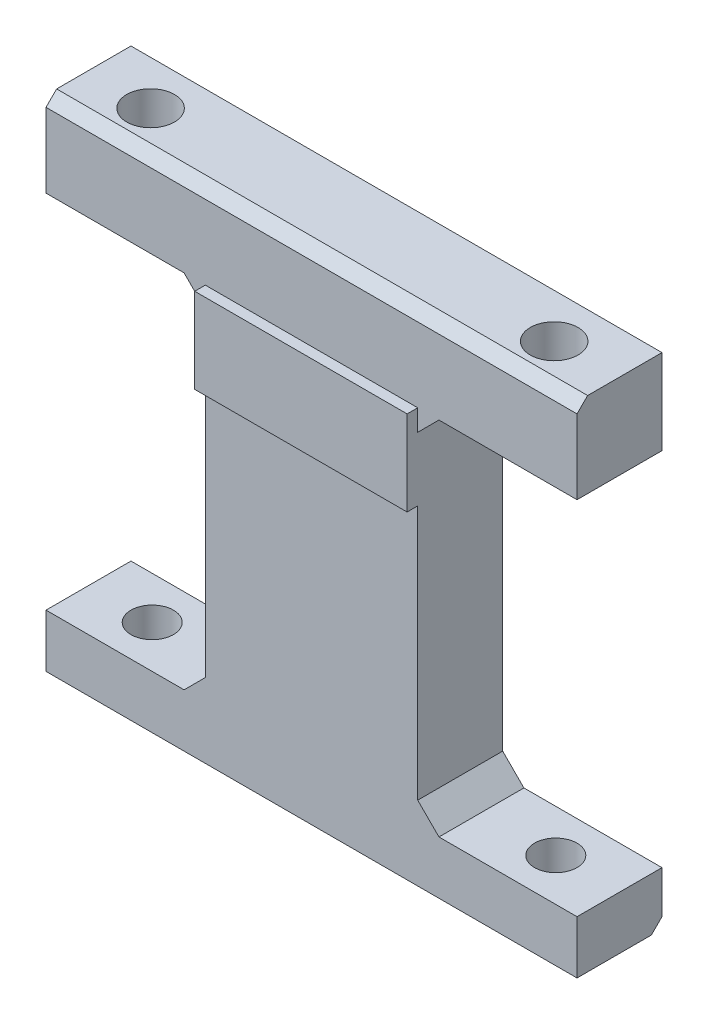
ISO-10303-21;
HEADER;
FILE_DESCRIPTION(('STEP AP214'),'2;1');
FILE_NAME('part.step','',(''),(''),'','','');
FILE_SCHEMA(('AUTOMOTIVE_DESIGN { 1 0 10303 214 1 1 1 1 }'));
ENDSEC;
DATA;
#1=APPLICATION_CONTEXT('core data for automotive mechanical design processes');
#2=APPLICATION_PROTOCOL_DEFINITION('international standard','automotive_design',2000,#1);
#3=PRODUCT_CONTEXT('',#1,'mechanical');
#4=PRODUCT('Part','Part','',(#3));
#5=PRODUCT_RELATED_PRODUCT_CATEGORY('part','',(#4));
#6=PRODUCT_DEFINITION_FORMATION('','',#4);
#7=PRODUCT_DEFINITION_CONTEXT('part definition',#1,'design');
#8=PRODUCT_DEFINITION('design','',#6,#7);
#9=PRODUCT_DEFINITION_SHAPE('','',#8);
#10=(LENGTH_UNIT() NAMED_UNIT(*) SI_UNIT(.MILLI.,.METRE.));
#11=(NAMED_UNIT(*) PLANE_ANGLE_UNIT() SI_UNIT($,.RADIAN.));
#12=(NAMED_UNIT(*) SI_UNIT($,.STERADIAN.) SOLID_ANGLE_UNIT());
#13=UNCERTAINTY_MEASURE_WITH_UNIT(LENGTH_MEASURE(1.E-05),#10,'distance_accuracy_value','');
#14=(GEOMETRIC_REPRESENTATION_CONTEXT(3) GLOBAL_UNCERTAINTY_ASSIGNED_CONTEXT((#13)) GLOBAL_UNIT_ASSIGNED_CONTEXT((#10,
#11,#12)) REPRESENTATION_CONTEXT('',''));
#15=CARTESIAN_POINT('',(0.,0.,0.));
#16=DIRECTION('',(0.,0.,1.));
#17=DIRECTION('',(1.,0.,0.));
#18=AXIS2_PLACEMENT_3D('',#15,#16,#17);
#19=CARTESIAN_POINT('',(0.,0.,0.));
#20=DIRECTION('',(0.,0.,1.));
#21=DIRECTION('',(1.,0.,0.));
#22=AXIS2_PLACEMENT_3D('',#19,#20,#21);
#23=PLANE('',#22);
#24=DIRECTION('',(0.,1.,0.));
#25=VECTOR('',#24,1.);
#26=CARTESIAN_POINT('',(25.,39.,0.));
#27=LINE('',#26,#25);
#28=CARTESIAN_POINT('',(25.,39.,0.));
#29=VERTEX_POINT('',#28);
#30=CARTESIAN_POINT('',(25.,46.,0.));
#31=VERTEX_POINT('',#30);
#32=EDGE_CURVE('E285',#29,#31,#27,.T.);
#33=ORIENTED_EDGE('',*,*,#32,.T.);
#34=DIRECTION('',(-1.,0.,0.));
#35=VECTOR('',#34,1.);
#36=CARTESIAN_POINT('',(0.,46.,0.));
#37=LINE('',#36,#35);
#38=CARTESIAN_POINT('',(-25.,46.,0.));
#39=VERTEX_POINT('',#38);
#40=EDGE_CURVE('E447',#31,#39,#37,.T.);
#41=ORIENTED_EDGE('',*,*,#40,.T.);
#42=DIRECTION('',(0.,-1.,0.));
#43=VECTOR('',#42,1.);
#44=CARTESIAN_POINT('',(-25.,47.,0.));
#45=LINE('',#44,#43);
#46=CARTESIAN_POINT('',(-25.,39.,0.));
#47=VERTEX_POINT('',#46);
#48=EDGE_CURVE('E299',#39,#47,#45,.T.);
#49=ORIENTED_EDGE('',*,*,#48,.T.);
#50=DIRECTION('',(1.,0.,0.));
#51=VECTOR('',#50,1.);
#52=CARTESIAN_POINT('',(-25.,39.,0.));
#53=LINE('',#52,#51);
#54=CARTESIAN_POINT('',(-12.,39.,0.));
#55=VERTEX_POINT('',#54);
#56=EDGE_CURVE('E304',#47,#55,#53,.T.);
#57=ORIENTED_EDGE('',*,*,#56,.T.);
#58=DIRECTION('',(-0.707106781186552,0.707106781186543,0.));
#59=VECTOR('',#58,1.);
#60=CARTESIAN_POINT('',(-12.,39.,0.));
#61=LINE('',#60,#59);
#62=CARTESIAN_POINT('',(-10.,37.,0.));
#63=VERTEX_POINT('',#62);
#64=EDGE_CURVE('E429',#55,#63,#61,.F.);
#65=ORIENTED_EDGE('',*,*,#64,.T.);
#66=DIRECTION('',(0.,-1.,0.));
#67=VECTOR('',#66,1.);
#68=CARTESIAN_POINT('',(-9.99999999999999,0.,0.));
#69=LINE('',#68,#67);
#70=CARTESIAN_POINT('',(-10.,39.,0.));
#71=VERTEX_POINT('',#70);
#72=EDGE_CURVE('E412',#71,#63,#69,.T.);
#73=ORIENTED_EDGE('',*,*,#72,.F.);
#74=DIRECTION('',(-1.,0.,0.));
#75=VECTOR('',#74,1.);
#76=CARTESIAN_POINT('',(-10.,39.,0.));
#77=LINE('',#76,#75);
#78=CARTESIAN_POINT('',(10.,39.,0.));
#79=VERTEX_POINT('',#78);
#80=EDGE_CURVE('E249',#79,#71,#77,.T.);
#81=ORIENTED_EDGE('',*,*,#80,.F.);
#82=DIRECTION('',(0.,1.,0.));
#83=VECTOR('',#82,1.);
#84=CARTESIAN_POINT('',(10.,0.,0.));
#85=LINE('',#84,#83);
#86=CARTESIAN_POINT('',(10.,37.,0.));
#87=VERTEX_POINT('',#86);
#88=EDGE_CURVE('E392',#87,#79,#85,.T.);
#89=ORIENTED_EDGE('',*,*,#88,.F.);
#90=DIRECTION('',(-0.707106781186542,-0.707106781186553,0.));
#91=VECTOR('',#90,1.);
#92=CARTESIAN_POINT('',(10.,37.,0.));
#93=LINE('',#92,#91);
#94=CARTESIAN_POINT('',(12.,39.,0.));
#95=VERTEX_POINT('',#94);
#96=EDGE_CURVE('E423',#87,#95,#93,.F.);
#97=ORIENTED_EDGE('',*,*,#96,.T.);
#98=EDGE_CURVE('E302',#95,#29,#53,.T.);
#99=ORIENTED_EDGE('',*,*,#98,.T.);
#100=EDGE_LOOP('',(#33,#41,#49,#57,#65,#73,#81,#89,#97,#99));
#101=FACE_BOUND('',#100,.T.);
#102=ADVANCED_FACE('F77',(#101),#23,.T.);
#103=CARTESIAN_POINT('',(25.,47.,-8.));
#104=DIRECTION('',(0.,1.,0.));
#105=DIRECTION('',(-1.,0.,0.));
#106=AXIS2_PLACEMENT_3D('',#103,#104,#105);
#107=PLANE('',#106);
#108=CARTESIAN_POINT('',(-19.,47.,-3.8474065138723));
#109=DIRECTION('',(0.,1.,0.));
#110=DIRECTION('',(-1.,0.,0.));
#111=AXIS2_PLACEMENT_3D('',#108,#109,#110);
#112=CIRCLE('',#111,2.25);
#113=CARTESIAN_POINT('',(-21.25,47.,-3.8474065138723));
#114=VERTEX_POINT('',#113);
#115=EDGE_CURVE('E389',#114,#114,#112,.T.);
#116=ORIENTED_EDGE('',*,*,#115,.F.);
#117=EDGE_LOOP('',(#116));
#118=FACE_BOUND('',#117,.T.);
#119=CARTESIAN_POINT('',(19.,47.,-3.8474065138723));
#120=DIRECTION('',(0.,1.,0.));
#121=DIRECTION('',(-1.,0.,0.));
#122=AXIS2_PLACEMENT_3D('',#119,#120,#121);
#123=CIRCLE('',#122,2.25);
#124=CARTESIAN_POINT('',(16.75,47.,-3.8474065138723));
#125=VERTEX_POINT('',#124);
#126=EDGE_CURVE('E384',#125,#125,#123,.T.);
#127=ORIENTED_EDGE('',*,*,#126,.F.);
#128=EDGE_LOOP('',(#127));
#129=FACE_BOUND('',#128,.T.);
#130=DIRECTION('',(0.,0.,1.));
#131=VECTOR('',#130,1.);
#132=CARTESIAN_POINT('',(-25.,47.,-8.));
#133=LINE('',#132,#131);
#134=CARTESIAN_POINT('',(-25.,47.,-8.));
#135=VERTEX_POINT('',#134);
#136=CARTESIAN_POINT('',(-25.,47.,-1.00000000000001));
#137=VERTEX_POINT('',#136);
#138=EDGE_CURVE('E311',#135,#137,#133,.T.);
#139=ORIENTED_EDGE('',*,*,#138,.T.);
#140=DIRECTION('',(1.,0.,0.));
#141=VECTOR('',#140,1.);
#142=CARTESIAN_POINT('',(25.,47.,-1.00000000000001));
#143=LINE('',#142,#141);
#144=CARTESIAN_POINT('',(25.,47.,-1.00000000000001));
#145=VERTEX_POINT('',#144);
#146=EDGE_CURVE('E454',#137,#145,#143,.T.);
#147=ORIENTED_EDGE('',*,*,#146,.T.);
#148=DIRECTION('',(0.,0.,1.));
#149=VECTOR('',#148,1.);
#150=CARTESIAN_POINT('',(25.,47.,-8.));
#151=LINE('',#150,#149);
#152=CARTESIAN_POINT('',(25.,47.,-8.));
#153=VERTEX_POINT('',#152);
#154=EDGE_CURVE('E316',#153,#145,#151,.T.);
#155=ORIENTED_EDGE('',*,*,#154,.F.);
#156=DIRECTION('',(-1.,0.,0.));
#157=VECTOR('',#156,1.);
#158=CARTESIAN_POINT('',(25.,47.,-8.));
#159=LINE('',#158,#157);
#160=EDGE_CURVE('E294',#153,#135,#159,.T.);
#161=ORIENTED_EDGE('',*,*,#160,.T.);
#162=EDGE_LOOP('',(#139,#147,#155,#161));
#163=FACE_BOUND('',#162,.T.);
#164=ADVANCED_FACE('F539',(#118,#129,#163),#107,.T.);
#165=CARTESIAN_POINT('',(25.,39.,-8.));
#166=DIRECTION('',(1.,0.,0.));
#167=DIRECTION('',(0.,0.,-1.));
#168=AXIS2_PLACEMENT_3D('',#165,#166,#167);
#169=PLANE('',#168);
#170=ORIENTED_EDGE('',*,*,#154,.T.);
#171=DIRECTION('',(0.,0.707106781186544,-0.707106781186551));
#172=VECTOR('',#171,1.);
#173=CARTESIAN_POINT('',(25.,46.5,-0.500000000000048));
#174=LINE('',#173,#172);
#175=EDGE_CURVE('E457',#145,#31,#174,.F.);
#176=ORIENTED_EDGE('',*,*,#175,.T.);
#177=ORIENTED_EDGE('',*,*,#32,.F.);
#178=DIRECTION('',(0.,0.,1.));
#179=VECTOR('',#178,1.);
#180=CARTESIAN_POINT('',(25.,39.,-8.));
#181=LINE('',#180,#179);
#182=CARTESIAN_POINT('',(25.,39.,-8.));
#183=VERTEX_POINT('',#182);
#184=EDGE_CURVE('E320',#183,#29,#181,.T.);
#185=ORIENTED_EDGE('',*,*,#184,.F.);
#186=DIRECTION('',(0.,1.,0.));
#187=VECTOR('',#186,1.);
#188=CARTESIAN_POINT('',(25.,39.,-8.));
#189=LINE('',#188,#187);
#190=EDGE_CURVE('E290',#183,#153,#189,.T.);
#191=ORIENTED_EDGE('',*,*,#190,.T.);
#192=EDGE_LOOP('',(#170,#176,#177,#185,#191));
#193=FACE_BOUND('',#192,.T.);
#194=ADVANCED_FACE('F544',(#193),#169,.T.);
#195=CARTESIAN_POINT('',(-25.,47.,-8.));
#196=DIRECTION('',(-1.,0.,0.));
#197=DIRECTION('',(0.,-1.,0.));
#198=AXIS2_PLACEMENT_3D('',#195,#196,#197);
#199=PLANE('',#198);
#200=ORIENTED_EDGE('',*,*,#48,.F.);
#201=DIRECTION('',(0.,-0.707106781186544,0.707106781186551));
#202=VECTOR('',#201,1.);
#203=CARTESIAN_POINT('',(-25.,50.5,-4.50000000000004));
#204=LINE('',#203,#202);
#205=EDGE_CURVE('E451',#39,#137,#204,.F.);
#206=ORIENTED_EDGE('',*,*,#205,.T.);
#207=ORIENTED_EDGE('',*,*,#138,.F.);
#208=DIRECTION('',(0.,-1.,0.));
#209=VECTOR('',#208,1.);
#210=CARTESIAN_POINT('',(-25.,47.,-8.));
#211=LINE('',#210,#209);
#212=CARTESIAN_POINT('',(-25.,39.,-8.));
#213=VERTEX_POINT('',#212);
#214=EDGE_CURVE('E280',#135,#213,#211,.T.);
#215=ORIENTED_EDGE('',*,*,#214,.T.);
#216=DIRECTION('',(0.,0.,1.));
#217=VECTOR('',#216,1.);
#218=CARTESIAN_POINT('',(-25.,39.,-8.));
#219=LINE('',#218,#217);
#220=EDGE_CURVE('E298',#213,#47,#219,.T.);
#221=ORIENTED_EDGE('',*,*,#220,.T.);
#222=EDGE_LOOP('',(#200,#206,#207,#215,#221));
#223=FACE_BOUND('',#222,.T.);
#224=ADVANCED_FACE('F535',(#223),#199,.T.);
#225=DIRECTION('',(1.,0.,0.));
#226=VECTOR('',#225,1.);
#227=CARTESIAN_POINT('',(-10.,31.,0.));
#228=LINE('',#227,#226);
#229=CARTESIAN_POINT('',(-10.,31.,0.));
#230=VERTEX_POINT('',#229);
#231=CARTESIAN_POINT('',(10.,31.,0.));
#232=VERTEX_POINT('',#231);
#233=EDGE_CURVE('E383',#230,#232,#228,.T.);
#234=ORIENTED_EDGE('',*,*,#233,.F.);
#235=DIRECTION('',(0.,-1.,0.));
#236=VECTOR('',#235,1.);
#237=CARTESIAN_POINT('',(-10.,39.,0.));
#238=LINE('',#237,#236);
#239=CARTESIAN_POINT('',(-9.99999999999999,7.00000000000002,0.));
#240=VERTEX_POINT('',#239);
#241=EDGE_CURVE('E255',#230,#240,#238,.T.);
#242=ORIENTED_EDGE('',*,*,#241,.T.);
#243=DIRECTION('',(0.707106781186544,0.707106781186552,0.));
#244=VECTOR('',#243,1.);
#245=CARTESIAN_POINT('',(-9.99999999999999,7.00000000000002,0.));
#246=LINE('',#245,#244);
#247=CARTESIAN_POINT('',(-12.,5.,0.));
#248=VERTEX_POINT('',#247);
#249=EDGE_CURVE('E441',#240,#248,#246,.F.);
#250=ORIENTED_EDGE('',*,*,#249,.T.);
#251=DIRECTION('',(-1.,0.,0.));
#252=VECTOR('',#251,1.);
#253=CARTESIAN_POINT('',(25.,5.,0.));
#254=LINE('',#253,#252);
#255=CARTESIAN_POINT('',(-25.,4.99999999999999,0.));
#256=VERTEX_POINT('',#255);
#257=EDGE_CURVE('E364',#248,#256,#254,.T.);
#258=ORIENTED_EDGE('',*,*,#257,.T.);
#259=DIRECTION('',(0.,-1.,0.));
#260=VECTOR('',#259,1.);
#261=CARTESIAN_POINT('',(-25.,4.99999999999999,0.));
#262=LINE('',#261,#260);
#263=CARTESIAN_POINT('',(-25.,0.,0.));
#264=VERTEX_POINT('',#263);
#265=EDGE_CURVE('E279',#256,#264,#262,.T.);
#266=ORIENTED_EDGE('',*,*,#265,.T.);
#267=DIRECTION('',(1.,0.,0.));
#268=VECTOR('',#267,1.);
#269=CARTESIAN_POINT('',(0.,0.,0.));
#270=LINE('',#269,#268);
#271=CARTESIAN_POINT('',(25.,0.,0.));
#272=VERTEX_POINT('',#271);
#273=EDGE_CURVE('E356',#264,#272,#270,.T.);
#274=ORIENTED_EDGE('',*,*,#273,.T.);
#275=DIRECTION('',(0.,1.,0.));
#276=VECTOR('',#275,1.);
#277=CARTESIAN_POINT('',(25.,0.,0.));
#278=LINE('',#277,#276);
#279=CARTESIAN_POINT('',(25.,5.,0.));
#280=VERTEX_POINT('',#279);
#281=EDGE_CURVE('E360',#272,#280,#278,.T.);
#282=ORIENTED_EDGE('',*,*,#281,.T.);
#283=CARTESIAN_POINT('',(12.,5.,0.));
#284=VERTEX_POINT('',#283);
#285=EDGE_CURVE('E344',#280,#284,#254,.T.);
#286=ORIENTED_EDGE('',*,*,#285,.T.);
#287=DIRECTION('',(0.707106781186552,-0.707106781186543,0.));
#288=VECTOR('',#287,1.);
#289=CARTESIAN_POINT('',(12.,5.,0.));
#290=LINE('',#289,#288);
#291=CARTESIAN_POINT('',(10.,7.,0.));
#292=VERTEX_POINT('',#291);
#293=EDGE_CURVE('E435',#284,#292,#290,.F.);
#294=ORIENTED_EDGE('',*,*,#293,.T.);
#295=DIRECTION('',(0.,1.,0.));
#296=VECTOR('',#295,1.);
#297=CARTESIAN_POINT('',(10.,5.,0.));
#298=LINE('',#297,#296);
#299=EDGE_CURVE('E331',#292,#232,#298,.T.);
#300=ORIENTED_EDGE('',*,*,#299,.T.);
#301=EDGE_LOOP('',(#234,#242,#250,#258,#266,#274,#282,#286,#294,#300));
#302=FACE_BOUND('',#301,.T.);
#303=ADVANCED_FACE('F472',(#302),#23,.T.);
#304=CARTESIAN_POINT('',(0.,0.,-8.));
#305=DIRECTION('',(0.,0.,1.));
#306=DIRECTION('',(1.,0.,0.));
#307=AXIS2_PLACEMENT_3D('',#304,#305,#306);
#308=PLANE('',#307);
#309=DIRECTION('',(0.,1.,0.));
#310=VECTOR('',#309,1.);
#311=CARTESIAN_POINT('',(25.,0.,-8.));
#312=LINE('',#311,#310);
#313=CARTESIAN_POINT('',(25.,1.00000000000001,-8.));
#314=VERTEX_POINT('',#313);
#315=CARTESIAN_POINT('',(25.,5.,-8.));
#316=VERTEX_POINT('',#315);
#317=EDGE_CURVE('E343',#314,#316,#312,.T.);
#318=ORIENTED_EDGE('',*,*,#317,.F.);
#319=DIRECTION('',(-1.,0.,0.));
#320=VECTOR('',#319,1.);
#321=CARTESIAN_POINT('',(-25.,1.00000000000001,-8.));
#322=LINE('',#321,#320);
#323=CARTESIAN_POINT('',(-25.,1.00000000000001,-8.));
#324=VERTEX_POINT('',#323);
#325=EDGE_CURVE('E87',#314,#324,#322,.T.);
#326=ORIENTED_EDGE('',*,*,#325,.T.);
#327=DIRECTION('',(0.,-1.,0.));
#328=VECTOR('',#327,1.);
#329=CARTESIAN_POINT('',(-25.,4.99999999999999,-8.));
#330=LINE('',#329,#328);
#331=CARTESIAN_POINT('',(-25.,4.99999999999999,-8.));
#332=VERTEX_POINT('',#331);
#333=EDGE_CURVE('E340',#332,#324,#330,.T.);
#334=ORIENTED_EDGE('',*,*,#333,.F.);
#335=DIRECTION('',(-1.,0.,0.));
#336=VECTOR('',#335,1.);
#337=CARTESIAN_POINT('',(25.,5.,-8.));
#338=LINE('',#337,#336);
#339=CARTESIAN_POINT('',(-12.,5.,-8.));
#340=VERTEX_POINT('',#339);
#341=EDGE_CURVE('E347',#340,#332,#338,.T.);
#342=ORIENTED_EDGE('',*,*,#341,.F.);
#343=DIRECTION('',(-0.707106781186544,-0.707106781186552,0.));
#344=VECTOR('',#343,1.);
#345=CARTESIAN_POINT('',(-8.50000000000006,8.49999999999997,-8.));
#346=LINE('',#345,#344);
#347=CARTESIAN_POINT('',(-9.99999999999999,7.00000000000002,-8.));
#348=VERTEX_POINT('',#347);
#349=EDGE_CURVE('E444',#340,#348,#346,.F.);
#350=ORIENTED_EDGE('',*,*,#349,.T.);
#351=DIRECTION('',(0.,-1.,0.));
#352=VECTOR('',#351,1.);
#353=CARTESIAN_POINT('',(-10.,39.,-8.));
#354=LINE('',#353,#352);
#355=CARTESIAN_POINT('',(-10.,37.,-8.));
#356=VERTEX_POINT('',#355);
#357=EDGE_CURVE('E327',#356,#348,#354,.T.);
#358=ORIENTED_EDGE('',*,*,#357,.F.);
#359=DIRECTION('',(0.707106781186552,-0.707106781186543,0.));
#360=VECTOR('',#359,1.);
#361=CARTESIAN_POINT('',(13.5000000000001,13.5000000000003,-8.));
#362=LINE('',#361,#360);
#363=CARTESIAN_POINT('',(-12.,39.,-8.));
#364=VERTEX_POINT('',#363);
#365=EDGE_CURVE('E432',#356,#364,#362,.F.);
#366=ORIENTED_EDGE('',*,*,#365,.T.);
#367=DIRECTION('',(1.,0.,0.));
#368=VECTOR('',#367,1.);
#369=CARTESIAN_POINT('',(-25.,39.,-8.));
#370=LINE('',#369,#368);
#371=EDGE_CURVE('E286',#213,#364,#370,.T.);
#372=ORIENTED_EDGE('',*,*,#371,.F.);
#373=ORIENTED_EDGE('',*,*,#214,.F.);
#374=ORIENTED_EDGE('',*,*,#160,.F.);
#375=ORIENTED_EDGE('',*,*,#190,.F.);
#376=CARTESIAN_POINT('',(12.,39.,-8.));
#377=VERTEX_POINT('',#376);
#378=EDGE_CURVE('E284',#377,#183,#370,.T.);
#379=ORIENTED_EDGE('',*,*,#378,.F.);
#380=DIRECTION('',(0.707106781186542,0.707106781186553,0.));
#381=VECTOR('',#380,1.);
#382=CARTESIAN_POINT('',(-13.4999999999999,13.4999999999997,-8.));
#383=LINE('',#382,#381);
#384=CARTESIAN_POINT('',(10.,37.,-8.));
#385=VERTEX_POINT('',#384);
#386=EDGE_CURVE('E426',#377,#385,#383,.F.);
#387=ORIENTED_EDGE('',*,*,#386,.T.);
#388=DIRECTION('',(0.,1.,0.));
#389=VECTOR('',#388,1.);
#390=CARTESIAN_POINT('',(10.,5.,-8.));
#391=LINE('',#390,#389);
#392=CARTESIAN_POINT('',(10.,7.,-8.));
#393=VERTEX_POINT('',#392);
#394=EDGE_CURVE('E303',#393,#385,#391,.T.);
#395=ORIENTED_EDGE('',*,*,#394,.F.);
#396=DIRECTION('',(-0.707106781186552,0.707106781186543,0.));
#397=VECTOR('',#396,1.);
#398=CARTESIAN_POINT('',(8.49999999999993,8.50000000000005,-8.));
#399=LINE('',#398,#397);
#400=CARTESIAN_POINT('',(12.,5.,-8.));
#401=VERTEX_POINT('',#400);
#402=EDGE_CURVE('E438',#393,#401,#399,.F.);
#403=ORIENTED_EDGE('',*,*,#402,.T.);
#404=EDGE_CURVE('E348',#316,#401,#338,.T.);
#405=ORIENTED_EDGE('',*,*,#404,.F.);
#406=EDGE_LOOP('',(#318,#326,#334,#342,#350,#358,#366,#372,#373,#374,#375,#379,#387,#395,#403,#405));
#407=FACE_BOUND('',#406,.T.);
#408=ADVANCED_FACE('F528',(#407),#308,.F.);
#409=CARTESIAN_POINT('',(-25.,39.,-8.));
#410=DIRECTION('',(0.,-1.,0.));
#411=DIRECTION('',(0.,0.,-1.));
#412=AXIS2_PLACEMENT_3D('',#409,#410,#411);
#413=PLANE('',#412);
#414=CARTESIAN_POINT('',(-19.,39.,-3.8474065138723));
#415=DIRECTION('',(0.,-1.,0.));
#416=DIRECTION('',(0.,0.,-1.));
#417=AXIS2_PLACEMENT_3D('',#414,#415,#416);
#418=CIRCLE('',#417,2.25);
#419=CARTESIAN_POINT('',(-19.,39.,-6.0974065138723));
#420=VERTEX_POINT('',#419);
#421=EDGE_CURVE('E385',#420,#420,#418,.T.);
#422=ORIENTED_EDGE('',*,*,#421,.F.);
#423=EDGE_LOOP('',(#422));
#424=FACE_BOUND('',#423,.T.);
#425=ORIENTED_EDGE('',*,*,#371,.T.);
#426=DIRECTION('',(0.,0.,1.));
#427=VECTOR('',#426,1.);
#428=CARTESIAN_POINT('',(-12.,39.,0.));
#429=LINE('',#428,#427);
#430=EDGE_CURVE('E402',#364,#55,#429,.T.);
#431=ORIENTED_EDGE('',*,*,#430,.T.);
#432=ORIENTED_EDGE('',*,*,#56,.F.);
#433=ORIENTED_EDGE('',*,*,#220,.F.);
#434=EDGE_LOOP('',(#425,#431,#432,#433));
#435=FACE_BOUND('',#434,.T.);
#436=ADVANCED_FACE('F531',(#424,#435),#413,.T.);
#437=CARTESIAN_POINT('',(19.,39.,-3.8474065138723));
#438=DIRECTION('',(0.,-1.,0.));
#439=DIRECTION('',(0.,0.,-1.));
#440=AXIS2_PLACEMENT_3D('',#437,#438,#439);
#441=CIRCLE('',#440,2.25);
#442=CARTESIAN_POINT('',(19.,39.,-6.0974065138723));
#443=VERTEX_POINT('',#442);
#444=EDGE_CURVE('E379',#443,#443,#441,.T.);
#445=ORIENTED_EDGE('',*,*,#444,.F.);
#446=EDGE_LOOP('',(#445));
#447=FACE_BOUND('',#446,.T.);
#448=ORIENTED_EDGE('',*,*,#98,.F.);
#449=DIRECTION('',(0.,0.,-1.));
#450=VECTOR('',#449,1.);
#451=CARTESIAN_POINT('',(12.,39.,-8.));
#452=LINE('',#451,#450);
#453=EDGE_CURVE('E399',#95,#377,#452,.T.);
#454=ORIENTED_EDGE('',*,*,#453,.T.);
#455=ORIENTED_EDGE('',*,*,#378,.T.);
#456=ORIENTED_EDGE('',*,*,#184,.T.);
#457=EDGE_LOOP('',(#448,#454,#455,#456));
#458=FACE_BOUND('',#457,.T.);
#459=ADVANCED_FACE('F563',(#447,#458),#413,.T.);
#460=CARTESIAN_POINT('',(0.,0.,-8.));
#461=DIRECTION('',(0.,-1.,0.));
#462=DIRECTION('',(0.,0.,-1.));
#463=AXIS2_PLACEMENT_3D('',#460,#461,#462);
#464=PLANE('',#463);
#465=CARTESIAN_POINT('',(19.,0.,-4.));
#466=DIRECTION('',(0.,-1.,0.));
#467=DIRECTION('',(0.,0.,-1.));
#468=AXIS2_PLACEMENT_3D('',#465,#466,#467);
#469=CIRCLE('',#468,2.);
#470=CARTESIAN_POINT('',(19.,0.,-6.));
#471=VERTEX_POINT('',#470);
#472=EDGE_CURVE('E275',#471,#471,#469,.T.);
#473=ORIENTED_EDGE('',*,*,#472,.F.);
#474=EDGE_LOOP('',(#473));
#475=FACE_BOUND('',#474,.T.);
#476=CARTESIAN_POINT('',(-19.,0.,-4.));
#477=DIRECTION('',(0.,-1.,0.));
#478=DIRECTION('',(0.,0.,-1.));
#479=AXIS2_PLACEMENT_3D('',#476,#477,#478);
#480=CIRCLE('',#479,2.);
#481=CARTESIAN_POINT('',(-19.,0.,-6.));
#482=VERTEX_POINT('',#481);
#483=EDGE_CURVE('E270',#482,#482,#480,.T.);
#484=ORIENTED_EDGE('',*,*,#483,.F.);
#485=EDGE_LOOP('',(#484));
#486=FACE_BOUND('',#485,.T.);
#487=DIRECTION('',(0.,0.,1.));
#488=VECTOR('',#487,1.);
#489=CARTESIAN_POINT('',(-25.,0.,-8.));
#490=LINE('',#489,#488);
#491=CARTESIAN_POINT('',(-25.,0.,-6.99999999999999));
#492=VERTEX_POINT('',#491);
#493=EDGE_CURVE('E352',#492,#264,#490,.T.);
#494=ORIENTED_EDGE('',*,*,#493,.F.);
#495=DIRECTION('',(1.,0.,0.));
#496=VECTOR('',#495,1.);
#497=CARTESIAN_POINT('',(25.,0.,-6.99999999999999));
#498=LINE('',#497,#496);
#499=CARTESIAN_POINT('',(25.,0.,-6.99999999999999));
#500=VERTEX_POINT('',#499);
#501=EDGE_CURVE('E460',#492,#500,#498,.T.);
#502=ORIENTED_EDGE('',*,*,#501,.T.);
#503=DIRECTION('',(0.,0.,1.));
#504=VECTOR('',#503,1.);
#505=CARTESIAN_POINT('',(25.,0.,-8.));
#506=LINE('',#505,#504);
#507=EDGE_CURVE('E374',#500,#272,#506,.T.);
#508=ORIENTED_EDGE('',*,*,#507,.T.);
#509=ORIENTED_EDGE('',*,*,#273,.F.);
#510=EDGE_LOOP('',(#494,#502,#508,#509));
#511=FACE_BOUND('',#510,.T.);
#512=ADVANCED_FACE('F486',(#475,#486,#511),#464,.T.);
#513=CARTESIAN_POINT('',(25.,0.,-8.));
#514=DIRECTION('',(1.,0.,0.));
#515=DIRECTION('',(0.,0.,-1.));
#516=AXIS2_PLACEMENT_3D('',#513,#514,#515);
#517=PLANE('',#516);
#518=ORIENTED_EDGE('',*,*,#507,.F.);
#519=DIRECTION('',(0.,0.707106781186548,-0.707106781186548));
#520=VECTOR('',#519,1.);
#521=CARTESIAN_POINT('',(25.,0.500000000000004,-7.5));
#522=LINE('',#521,#520);
#523=EDGE_CURVE('E101',#500,#314,#522,.T.);
#524=ORIENTED_EDGE('',*,*,#523,.T.);
#525=ORIENTED_EDGE('',*,*,#317,.T.);
#526=DIRECTION('',(0.,0.,1.));
#527=VECTOR('',#526,1.);
#528=CARTESIAN_POINT('',(25.,5.,-8.));
#529=LINE('',#528,#527);
#530=EDGE_CURVE('E371',#316,#280,#529,.T.);
#531=ORIENTED_EDGE('',*,*,#530,.T.);
#532=ORIENTED_EDGE('',*,*,#281,.F.);
#533=EDGE_LOOP('',(#518,#524,#525,#531,#532));
#534=FACE_BOUND('',#533,.T.);
#535=ADVANCED_FACE('F555',(#534),#517,.T.);
#536=CARTESIAN_POINT('',(-25.,4.99999999999999,-8.));
#537=DIRECTION('',(-1.,0.,0.));
#538=DIRECTION('',(0.,0.,1.));
#539=AXIS2_PLACEMENT_3D('',#536,#537,#538);
#540=PLANE('',#539);
#541=ORIENTED_EDGE('',*,*,#333,.T.);
#542=DIRECTION('',(0.,-0.707106781186548,0.707106781186548));
#543=VECTOR('',#542,1.);
#544=CARTESIAN_POINT('',(-25.,3.,-9.99999999999999));
#545=LINE('',#544,#543);
#546=EDGE_CURVE('E12',#324,#492,#545,.T.);
#547=ORIENTED_EDGE('',*,*,#546,.T.);
#548=ORIENTED_EDGE('',*,*,#493,.T.);
#549=ORIENTED_EDGE('',*,*,#265,.F.);
#550=DIRECTION('',(0.,0.,1.));
#551=VECTOR('',#550,1.);
#552=CARTESIAN_POINT('',(-25.,4.99999999999999,-8.));
#553=LINE('',#552,#551);
#554=EDGE_CURVE('E337',#332,#256,#553,.T.);
#555=ORIENTED_EDGE('',*,*,#554,.F.);
#556=EDGE_LOOP('',(#541,#547,#548,#549,#555));
#557=FACE_BOUND('',#556,.T.);
#558=ADVANCED_FACE('F480',(#557),#540,.T.);
#559=CARTESIAN_POINT('',(25.,5.,-8.));
#560=DIRECTION('',(0.,1.,0.));
#561=DIRECTION('',(-1.,0.,0.));
#562=AXIS2_PLACEMENT_3D('',#559,#560,#561);
#563=PLANE('',#562);
#564=CARTESIAN_POINT('',(19.,5.,-4.));
#565=DIRECTION('',(0.,1.,0.));
#566=DIRECTION('',(-1.,0.,0.));
#567=AXIS2_PLACEMENT_3D('',#564,#565,#566);
#568=CIRCLE('',#567,2.);
#569=CARTESIAN_POINT('',(17.,5.,-4.));
#570=VERTEX_POINT('',#569);
#571=EDGE_CURVE('E262',#570,#570,#568,.T.);
#572=ORIENTED_EDGE('',*,*,#571,.F.);
#573=EDGE_LOOP('',(#572));
#574=FACE_BOUND('',#573,.T.);
#575=ORIENTED_EDGE('',*,*,#404,.T.);
#576=DIRECTION('',(0.,0.,1.));
#577=VECTOR('',#576,1.);
#578=CARTESIAN_POINT('',(12.,5.,0.));
#579=LINE('',#578,#577);
#580=EDGE_CURVE('E416',#401,#284,#579,.T.);
#581=ORIENTED_EDGE('',*,*,#580,.T.);
#582=ORIENTED_EDGE('',*,*,#285,.F.);
#583=ORIENTED_EDGE('',*,*,#530,.F.);
#584=EDGE_LOOP('',(#575,#581,#582,#583));
#585=FACE_BOUND('',#584,.T.);
#586=ADVANCED_FACE('F491',(#574,#585),#563,.T.);
#587=CARTESIAN_POINT('',(-19.,4.99999999999999,-4.));
#588=DIRECTION('',(0.,1.,0.));
#589=DIRECTION('',(-1.,0.,0.));
#590=AXIS2_PLACEMENT_3D('',#587,#588,#589);
#591=CIRCLE('',#590,2.);
#592=CARTESIAN_POINT('',(-21.,4.99999999999999,-4.));
#593=VERTEX_POINT('',#592);
#594=EDGE_CURVE('E257',#593,#593,#591,.T.);
#595=ORIENTED_EDGE('',*,*,#594,.F.);
#596=EDGE_LOOP('',(#595));
#597=FACE_BOUND('',#596,.T.);
#598=ORIENTED_EDGE('',*,*,#257,.F.);
#599=DIRECTION('',(0.,0.,-1.));
#600=VECTOR('',#599,1.);
#601=CARTESIAN_POINT('',(-12.,5.,-8.));
#602=LINE('',#601,#600);
#603=EDGE_CURVE('E420',#248,#340,#602,.T.);
#604=ORIENTED_EDGE('',*,*,#603,.T.);
#605=ORIENTED_EDGE('',*,*,#341,.T.);
#606=ORIENTED_EDGE('',*,*,#554,.T.);
#607=EDGE_LOOP('',(#598,#604,#605,#606));
#608=FACE_BOUND('',#607,.T.);
#609=ADVANCED_FACE('F477',(#597,#608),#563,.T.);
#610=CARTESIAN_POINT('',(-10.,39.,-8.));
#611=DIRECTION('',(-1.,0.,0.));
#612=DIRECTION('',(0.,-1.,0.));
#613=AXIS2_PLACEMENT_3D('',#610,#611,#612);
#614=PLANE('',#613);
#615=DIRECTION('',(0.,0.,-1.));
#616=VECTOR('',#615,1.);
#617=CARTESIAN_POINT('',(-10.,39.,1.));
#618=LINE('',#617,#616);
#619=CARTESIAN_POINT('',(-10.,39.,1.));
#620=VERTEX_POINT('',#619);
#621=EDGE_CURVE('E507',#620,#71,#618,.T.);
#622=ORIENTED_EDGE('',*,*,#621,.T.);
#623=ORIENTED_EDGE('',*,*,#72,.T.);
#624=DIRECTION('',(0.,0.,-1.));
#625=VECTOR('',#624,1.);
#626=CARTESIAN_POINT('',(-10.,37.,-8.));
#627=LINE('',#626,#625);
#628=EDGE_CURVE('E409',#63,#356,#627,.T.);
#629=ORIENTED_EDGE('',*,*,#628,.T.);
#630=ORIENTED_EDGE('',*,*,#357,.T.);
#631=DIRECTION('',(0.,0.,1.));
#632=VECTOR('',#631,1.);
#633=CARTESIAN_POINT('',(-9.99999999999999,7.00000000000002,0.));
#634=LINE('',#633,#632);
#635=EDGE_CURVE('E406',#348,#240,#634,.T.);
#636=ORIENTED_EDGE('',*,*,#635,.T.);
#637=ORIENTED_EDGE('',*,*,#241,.F.);
#638=DIRECTION('',(0.,0.,-1.));
#639=VECTOR('',#638,1.);
#640=CARTESIAN_POINT('',(-10.,31.,1.));
#641=LINE('',#640,#639);
#642=CARTESIAN_POINT('',(-10.,31.,1.));
#643=VERTEX_POINT('',#642);
#644=EDGE_CURVE('E232',#643,#230,#641,.T.);
#645=ORIENTED_EDGE('',*,*,#644,.F.);
#646=DIRECTION('',(0.,-1.,0.));
#647=VECTOR('',#646,1.);
#648=CARTESIAN_POINT('',(-10.,39.,1.));
#649=LINE('',#648,#647);
#650=EDGE_CURVE('E239',#620,#643,#649,.T.);
#651=ORIENTED_EDGE('',*,*,#650,.F.);
#652=EDGE_LOOP('',(#622,#623,#629,#630,#636,#637,#645,#651));
#653=FACE_BOUND('',#652,.T.);
#654=ADVANCED_FACE('F252',(#653),#614,.T.);
#655=CARTESIAN_POINT('',(10.,5.,-8.));
#656=DIRECTION('',(1.,0.,0.));
#657=DIRECTION('',(0.,0.,-1.));
#658=AXIS2_PLACEMENT_3D('',#655,#656,#657);
#659=PLANE('',#658);
#660=ORIENTED_EDGE('',*,*,#394,.T.);
#661=DIRECTION('',(0.,0.,1.));
#662=VECTOR('',#661,1.);
#663=CARTESIAN_POINT('',(10.,37.,0.));
#664=LINE('',#663,#662);
#665=EDGE_CURVE('E395',#385,#87,#664,.T.);
#666=ORIENTED_EDGE('',*,*,#665,.T.);
#667=ORIENTED_EDGE('',*,*,#88,.T.);
#668=DIRECTION('',(0.,0.,-1.));
#669=VECTOR('',#668,1.);
#670=CARTESIAN_POINT('',(10.,39.,1.));
#671=LINE('',#670,#669);
#672=CARTESIAN_POINT('',(10.,39.,1.));
#673=VERTEX_POINT('',#672);
#674=EDGE_CURVE('E264',#673,#79,#671,.T.);
#675=ORIENTED_EDGE('',*,*,#674,.F.);
#676=DIRECTION('',(0.,1.,0.));
#677=VECTOR('',#676,1.);
#678=CARTESIAN_POINT('',(10.,39.,1.));
#679=LINE('',#678,#677);
#680=CARTESIAN_POINT('',(10.,31.,1.));
#681=VERTEX_POINT('',#680);
#682=EDGE_CURVE('E238',#681,#673,#679,.T.);
#683=ORIENTED_EDGE('',*,*,#682,.F.);
#684=DIRECTION('',(0.,0.,-1.));
#685=VECTOR('',#684,1.);
#686=CARTESIAN_POINT('',(10.,31.,1.));
#687=LINE('',#686,#685);
#688=EDGE_CURVE('E234',#681,#232,#687,.T.);
#689=ORIENTED_EDGE('',*,*,#688,.T.);
#690=ORIENTED_EDGE('',*,*,#299,.F.);
#691=DIRECTION('',(0.,0.,-1.));
#692=VECTOR('',#691,1.);
#693=CARTESIAN_POINT('',(10.,7.,-8.));
#694=LINE('',#693,#692);
#695=EDGE_CURVE('E315',#292,#393,#694,.T.);
#696=ORIENTED_EDGE('',*,*,#695,.T.);
#697=EDGE_LOOP('',(#660,#666,#667,#675,#683,#689,#690,#696));
#698=FACE_BOUND('',#697,.T.);
#699=ADVANCED_FACE('F500',(#698),#659,.T.);
#700=CARTESIAN_POINT('',(-19.,-3.00000000000001,-4.));
#701=DIRECTION('',(0.,1.,0.));
#702=DIRECTION('',(-1.,0.,0.));
#703=AXIS2_PLACEMENT_3D('',#700,#701,#702);
#704=CYLINDRICAL_SURFACE('',#703,2.);
#705=ORIENTED_EDGE('',*,*,#483,.T.);
#706=EDGE_LOOP('',(#705));
#707=FACE_BOUND('',#706,.T.);
#708=ORIENTED_EDGE('',*,*,#594,.T.);
#709=EDGE_LOOP('',(#708));
#710=FACE_BOUND('',#709,.T.);
#711=ADVANCED_FACE('F595',(#707,#710),#704,.F.);
#712=CARTESIAN_POINT('',(19.,-3.,-4.));
#713=DIRECTION('',(0.,1.,0.));
#714=DIRECTION('',(-1.,0.,0.));
#715=AXIS2_PLACEMENT_3D('',#712,#713,#714);
#716=CYLINDRICAL_SURFACE('',#715,2.);
#717=ORIENTED_EDGE('',*,*,#472,.T.);
#718=EDGE_LOOP('',(#717));
#719=FACE_BOUND('',#718,.T.);
#720=ORIENTED_EDGE('',*,*,#571,.T.);
#721=EDGE_LOOP('',(#720));
#722=FACE_BOUND('',#721,.T.);
#723=ADVANCED_FACE('F660',(#719,#722),#716,.F.);
#724=CARTESIAN_POINT('',(-10.,31.,1.));
#725=DIRECTION('',(0.,1.,0.));
#726=DIRECTION('',(0.,0.,1.));
#727=AXIS2_PLACEMENT_3D('',#724,#725,#726);
#728=PLANE('',#727);
#729=ORIENTED_EDGE('',*,*,#233,.T.);
#730=ORIENTED_EDGE('',*,*,#688,.F.);
#731=DIRECTION('',(1.,0.,0.));
#732=VECTOR('',#731,1.);
#733=CARTESIAN_POINT('',(-10.,31.,1.));
#734=LINE('',#733,#732);
#735=EDGE_CURVE('E227',#643,#681,#734,.T.);
#736=ORIENTED_EDGE('',*,*,#735,.F.);
#737=ORIENTED_EDGE('',*,*,#644,.T.);
#738=EDGE_LOOP('',(#729,#730,#736,#737));
#739=FACE_BOUND('',#738,.T.);
#740=ADVANCED_FACE('F230',(#739),#728,.F.);
#741=CARTESIAN_POINT('',(-10.,39.,1.));
#742=DIRECTION('',(0.,-1.,0.));
#743=DIRECTION('',(0.,0.,-1.));
#744=AXIS2_PLACEMENT_3D('',#741,#742,#743);
#745=PLANE('',#744);
#746=ORIENTED_EDGE('',*,*,#80,.T.);
#747=ORIENTED_EDGE('',*,*,#621,.F.);
#748=DIRECTION('',(-1.,0.,0.));
#749=VECTOR('',#748,1.);
#750=CARTESIAN_POINT('',(-10.,39.,1.));
#751=LINE('',#750,#749);
#752=EDGE_CURVE('E244',#673,#620,#751,.T.);
#753=ORIENTED_EDGE('',*,*,#752,.F.);
#754=ORIENTED_EDGE('',*,*,#674,.T.);
#755=EDGE_LOOP('',(#746,#747,#753,#754));
#756=FACE_BOUND('',#755,.T.);
#757=ADVANCED_FACE('F518',(#756),#745,.F.);
#758=CARTESIAN_POINT('',(0.,0.,1.));
#759=DIRECTION('',(0.,0.,1.));
#760=DIRECTION('',(1.,0.,0.));
#761=AXIS2_PLACEMENT_3D('',#758,#759,#760);
#762=PLANE('',#761);
#763=ORIENTED_EDGE('',*,*,#650,.T.);
#764=ORIENTED_EDGE('',*,*,#735,.T.);
#765=ORIENTED_EDGE('',*,*,#682,.T.);
#766=ORIENTED_EDGE('',*,*,#752,.T.);
#767=EDGE_LOOP('',(#763,#764,#765,#766));
#768=FACE_BOUND('',#767,.T.);
#769=ADVANCED_FACE('F242',(#768),#762,.T.);
#770=CARTESIAN_POINT('',(19.,37.,-3.8474065138723));
#771=DIRECTION('',(0.,1.,0.));
#772=DIRECTION('',(-1.,0.,0.));
#773=AXIS2_PLACEMENT_3D('',#770,#771,#772);
#774=CYLINDRICAL_SURFACE('',#773,2.25);
#775=ORIENTED_EDGE('',*,*,#444,.T.);
#776=EDGE_LOOP('',(#775));
#777=FACE_BOUND('',#776,.T.);
#778=ORIENTED_EDGE('',*,*,#126,.T.);
#779=EDGE_LOOP('',(#778));
#780=FACE_BOUND('',#779,.T.);
#781=ADVANCED_FACE('F644',(#777,#780),#774,.F.);
#782=CARTESIAN_POINT('',(-19.,37.,-3.8474065138723));
#783=DIRECTION('',(0.,1.,0.));
#784=DIRECTION('',(-1.,0.,0.));
#785=AXIS2_PLACEMENT_3D('',#782,#783,#784);
#786=CYLINDRICAL_SURFACE('',#785,2.25);
#787=ORIENTED_EDGE('',*,*,#421,.T.);
#788=EDGE_LOOP('',(#787));
#789=FACE_BOUND('',#788,.T.);
#790=ORIENTED_EDGE('',*,*,#115,.T.);
#791=EDGE_LOOP('',(#790));
#792=FACE_BOUND('',#791,.T.);
#793=ADVANCED_FACE('F641',(#789,#792),#786,.F.);
#794=CARTESIAN_POINT('',(10.,37.,-8.));
#795=DIRECTION('',(0.707106781186553,-0.707106781186542,0.));
#796=DIRECTION('',(0.,0.,-1.));
#797=AXIS2_PLACEMENT_3D('',#794,#795,#796);
#798=PLANE('',#797);
#799=ORIENTED_EDGE('',*,*,#386,.F.);
#800=ORIENTED_EDGE('',*,*,#453,.F.);
#801=ORIENTED_EDGE('',*,*,#96,.F.);
#802=ORIENTED_EDGE('',*,*,#665,.F.);
#803=EDGE_LOOP('',(#799,#800,#801,#802));
#804=FACE_BOUND('',#803,.T.);
#805=ADVANCED_FACE('F552',(#804),#798,.T.);
#806=CARTESIAN_POINT('',(-12.,39.,-8.));
#807=DIRECTION('',(-0.707106781186542,-0.707106781186552,0.));
#808=DIRECTION('',(0.,0.,-1.));
#809=AXIS2_PLACEMENT_3D('',#806,#807,#808);
#810=PLANE('',#809);
#811=ORIENTED_EDGE('',*,*,#365,.F.);
#812=ORIENTED_EDGE('',*,*,#628,.F.);
#813=ORIENTED_EDGE('',*,*,#64,.F.);
#814=ORIENTED_EDGE('',*,*,#430,.F.);
#815=EDGE_LOOP('',(#811,#812,#813,#814));
#816=FACE_BOUND('',#815,.T.);
#817=ADVANCED_FACE('F525',(#816),#810,.T.);
#818=CARTESIAN_POINT('',(12.,5.,-8.));
#819=DIRECTION('',(0.707106781186542,0.707106781186552,0.));
#820=DIRECTION('',(0.,0.,-1.));
#821=AXIS2_PLACEMENT_3D('',#818,#819,#820);
#822=PLANE('',#821);
#823=ORIENTED_EDGE('',*,*,#402,.F.);
#824=ORIENTED_EDGE('',*,*,#695,.F.);
#825=ORIENTED_EDGE('',*,*,#293,.F.);
#826=ORIENTED_EDGE('',*,*,#580,.F.);
#827=EDGE_LOOP('',(#823,#824,#825,#826));
#828=FACE_BOUND('',#827,.T.);
#829=ADVANCED_FACE('F496',(#828),#822,.T.);
#830=CARTESIAN_POINT('',(-9.99999999999999,7.00000000000002,-8.));
#831=DIRECTION('',(-0.707106781186551,0.707106781186543,0.));
#832=DIRECTION('',(0.,0.,-1.));
#833=AXIS2_PLACEMENT_3D('',#830,#831,#832);
#834=PLANE('',#833);
#835=ORIENTED_EDGE('',*,*,#349,.F.);
#836=ORIENTED_EDGE('',*,*,#603,.F.);
#837=ORIENTED_EDGE('',*,*,#249,.F.);
#838=ORIENTED_EDGE('',*,*,#635,.F.);
#839=EDGE_LOOP('',(#835,#836,#837,#838));
#840=FACE_BOUND('',#839,.T.);
#841=ADVANCED_FACE('F614',(#840),#834,.T.);
#842=CARTESIAN_POINT('',(0.,46.,0.));
#843=DIRECTION('',(0.,-0.707106781186551,-0.707106781186544));
#844=DIRECTION('',(-1.,0.,0.));
#845=AXIS2_PLACEMENT_3D('',#842,#843,#844);
#846=PLANE('',#845);
#847=ORIENTED_EDGE('',*,*,#175,.F.);
#848=ORIENTED_EDGE('',*,*,#146,.F.);
#849=ORIENTED_EDGE('',*,*,#205,.F.);
#850=ORIENTED_EDGE('',*,*,#40,.F.);
#851=EDGE_LOOP('',(#847,#848,#849,#850));
#852=FACE_BOUND('',#851,.T.);
#853=ADVANCED_FACE('F613',(#852),#846,.F.);
#854=CARTESIAN_POINT('',(0.,0.,-6.99999999999999));
#855=DIRECTION('',(0.,-0.707106781186547,-0.707106781186547));
#856=DIRECTION('',(-1.,0.,0.));
#857=AXIS2_PLACEMENT_3D('',#854,#855,#856);
#858=PLANE('',#857);
#859=ORIENTED_EDGE('',*,*,#546,.F.);
#860=ORIENTED_EDGE('',*,*,#325,.F.);
#861=ORIENTED_EDGE('',*,*,#523,.F.);
#862=ORIENTED_EDGE('',*,*,#501,.F.);
#863=EDGE_LOOP('',(#859,#860,#861,#862));
#864=FACE_BOUND('',#863,.T.);
#865=ADVANCED_FACE('F80',(#864),#858,.T.);
#866=CLOSED_SHELL('',(#102,#164,#194,#224,#303,#408,#436,#459,#512,#535,#558,#586,#609,#654,
#699,#711,#723,#740,#757,#769,#781,#793,#805,#817,#829,#841,#853,#865));
#867=MANIFOLD_SOLID_BREP('B2',#866);
#868=ADVANCED_BREP_SHAPE_REPRESENTATION('',(#18,#867),#14);
#869=SHAPE_DEFINITION_REPRESENTATION(#9,#868);
ENDSEC;
END-ISO-10303-21;
